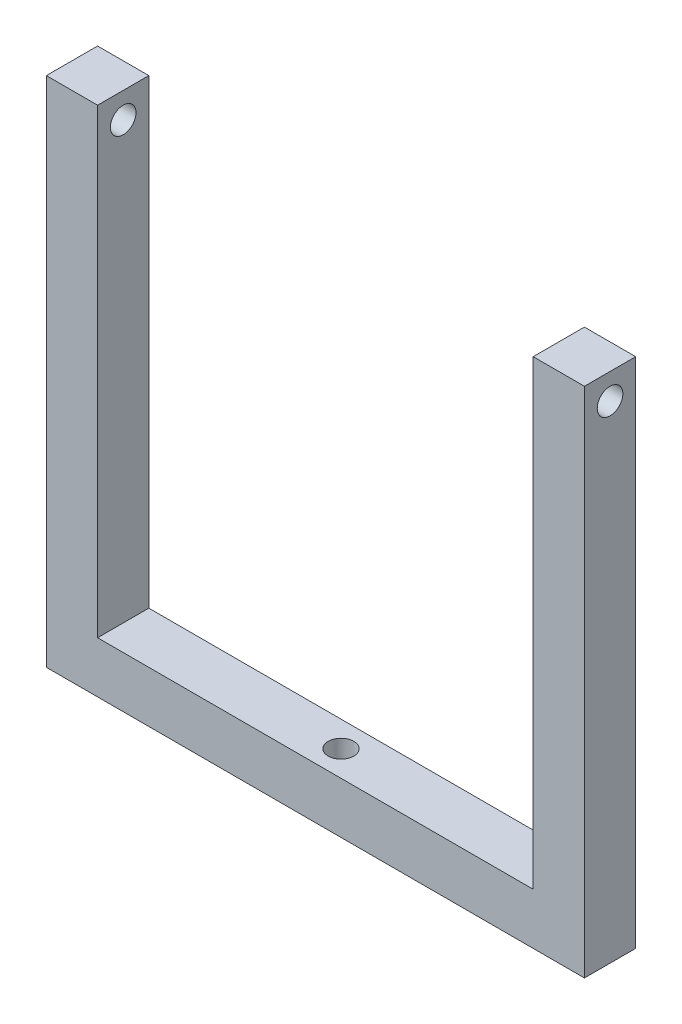
ISO-10303-21;
HEADER;
FILE_DESCRIPTION(('STEP AP214'),'2;1');
FILE_NAME('part.step','',(''),(''),'','','');
FILE_SCHEMA(('AUTOMOTIVE_DESIGN { 1 0 10303 214 1 1 1 1 }'));
ENDSEC;
DATA;
#1=APPLICATION_CONTEXT('core data for automotive mechanical design processes');
#2=APPLICATION_PROTOCOL_DEFINITION('international standard','automotive_design',2000,#1);
#3=PRODUCT_CONTEXT('',#1,'mechanical');
#4=PRODUCT('Part','Part','',(#3));
#5=PRODUCT_RELATED_PRODUCT_CATEGORY('part','',(#4));
#6=PRODUCT_DEFINITION_FORMATION('','',#4);
#7=PRODUCT_DEFINITION_CONTEXT('part definition',#1,'design');
#8=PRODUCT_DEFINITION('design','',#6,#7);
#9=PRODUCT_DEFINITION_SHAPE('','',#8);
#10=(LENGTH_UNIT() NAMED_UNIT(*) SI_UNIT(.MILLI.,.METRE.));
#11=(NAMED_UNIT(*) PLANE_ANGLE_UNIT() SI_UNIT($,.RADIAN.));
#12=(NAMED_UNIT(*) SI_UNIT($,.STERADIAN.) SOLID_ANGLE_UNIT());
#13=UNCERTAINTY_MEASURE_WITH_UNIT(LENGTH_MEASURE(1.E-05),#10,'distance_accuracy_value','');
#14=(GEOMETRIC_REPRESENTATION_CONTEXT(3) GLOBAL_UNCERTAINTY_ASSIGNED_CONTEXT((#13)) GLOBAL_UNIT_ASSIGNED_CONTEXT((#10,
#11,#12)) REPRESENTATION_CONTEXT('',''));
#15=CARTESIAN_POINT('',(0.,0.,0.));
#16=DIRECTION('',(0.,0.,1.));
#17=DIRECTION('',(1.,0.,0.));
#18=AXIS2_PLACEMENT_3D('',#15,#16,#17);
#19=CARTESIAN_POINT('',(0.,0.,12.7));
#20=DIRECTION('',(0.,-1.,0.));
#21=DIRECTION('',(1.,0.,0.));
#22=AXIS2_PLACEMENT_3D('',#19,#20,#21);
#23=PLANE('',#22);
#24=DIRECTION('',(-1.,0.,0.));
#25=VECTOR('',#24,1.);
#26=CARTESIAN_POINT('',(0.,0.,0.));
#27=LINE('',#26,#25);
#28=CARTESIAN_POINT('',(0.,0.,0.));
#29=VERTEX_POINT('',#28);
#30=CARTESIAN_POINT('',(-12.7,0.,0.));
#31=VERTEX_POINT('',#30);
#32=EDGE_CURVE('E141',#29,#31,#27,.T.);
#33=ORIENTED_EDGE('',*,*,#32,.T.);
#34=DIRECTION('',(0.,0.,-1.));
#35=VECTOR('',#34,1.);
#36=CARTESIAN_POINT('',(-12.7,0.,12.7));
#37=LINE('',#36,#35);
#38=CARTESIAN_POINT('',(-12.7,0.,12.7));
#39=VERTEX_POINT('',#38);
#40=EDGE_CURVE('E11',#39,#31,#37,.T.);
#41=ORIENTED_EDGE('',*,*,#40,.F.);
#42=DIRECTION('',(-1.,0.,0.));
#43=VECTOR('',#42,1.);
#44=CARTESIAN_POINT('',(0.,0.,12.7));
#45=LINE('',#44,#43);
#46=CARTESIAN_POINT('',(0.,0.,12.7));
#47=VERTEX_POINT('',#46);
#48=EDGE_CURVE('E164',#47,#39,#45,.T.);
#49=ORIENTED_EDGE('',*,*,#48,.F.);
#50=DIRECTION('',(0.,0.,-1.));
#51=VECTOR('',#50,1.);
#52=CARTESIAN_POINT('',(0.,0.,12.7));
#53=LINE('',#52,#51);
#54=EDGE_CURVE('E137',#47,#29,#53,.T.);
#55=ORIENTED_EDGE('',*,*,#54,.T.);
#56=EDGE_LOOP('',(#33,#41,#49,#55));
#57=FACE_BOUND('',#56,.T.);
#58=ADVANCED_FACE('F39',(#57),#23,.F.);
#59=CARTESIAN_POINT('',(-12.7,0.,12.7));
#60=DIRECTION('',(1.,0.,0.));
#61=DIRECTION('',(0.,1.,0.));
#62=AXIS2_PLACEMENT_3D('',#59,#60,#61);
#63=PLANE('',#62);
#64=CARTESIAN_POINT('',(-12.7,-6.35,6.35));
#65=DIRECTION('',(-1.,0.,0.));
#66=DIRECTION('',(0.,-1.,0.));
#67=AXIS2_PLACEMENT_3D('',#64,#65,#66);
#68=CIRCLE('',#67,3.175);
#69=CARTESIAN_POINT('',(-12.7,-9.525,6.35));
#70=VERTEX_POINT('',#69);
#71=EDGE_CURVE('E216',#70,#70,#68,.T.);
#72=ORIENTED_EDGE('',*,*,#71,.F.);
#73=EDGE_LOOP('',(#72));
#74=FACE_BOUND('',#73,.T.);
#75=DIRECTION('',(0.,-1.,0.));
#76=VECTOR('',#75,1.);
#77=CARTESIAN_POINT('',(-12.7,0.,0.));
#78=LINE('',#77,#76);
#79=CARTESIAN_POINT('',(-12.7,-127.,0.));
#80=VERTEX_POINT('',#79);
#81=EDGE_CURVE('E145',#31,#80,#78,.T.);
#82=ORIENTED_EDGE('',*,*,#81,.T.);
#83=DIRECTION('',(0.,0.,-1.));
#84=VECTOR('',#83,1.);
#85=CARTESIAN_POINT('',(-12.7,-127.,12.7));
#86=LINE('',#85,#84);
#87=CARTESIAN_POINT('',(-12.7,-127.,12.7));
#88=VERTEX_POINT('',#87);
#89=EDGE_CURVE('E49',#88,#80,#86,.T.);
#90=ORIENTED_EDGE('',*,*,#89,.F.);
#91=DIRECTION('',(0.,-1.,0.));
#92=VECTOR('',#91,1.);
#93=CARTESIAN_POINT('',(-12.7,0.,12.7));
#94=LINE('',#93,#92);
#95=EDGE_CURVE('E100',#39,#88,#94,.T.);
#96=ORIENTED_EDGE('',*,*,#95,.F.);
#97=ORIENTED_EDGE('',*,*,#40,.T.);
#98=EDGE_LOOP('',(#82,#90,#96,#97));
#99=FACE_BOUND('',#98,.T.);
#100=ADVANCED_FACE('F243',(#74,#99),#63,.F.);
#101=CARTESIAN_POINT('',(-12.7,-127.,12.7));
#102=DIRECTION('',(0.,1.,0.));
#103=DIRECTION('',(0.,0.,1.));
#104=AXIS2_PLACEMENT_3D('',#101,#102,#103);
#105=PLANE('',#104);
#106=CARTESIAN_POINT('',(53.975,-127.,6.35));
#107=DIRECTION('',(0.,1.,0.));
#108=DIRECTION('',(0.,0.,1.));
#109=AXIS2_PLACEMENT_3D('',#106,#107,#108);
#110=CIRCLE('',#109,3.17500000000001);
#111=CARTESIAN_POINT('',(53.975,-127.,9.52500000000001));
#112=VERTEX_POINT('',#111);
#113=EDGE_CURVE('E220',#112,#112,#110,.F.);
#114=ORIENTED_EDGE('',*,*,#113,.F.);
#115=EDGE_LOOP('',(#114));
#116=FACE_BOUND('',#115,.T.);
#117=DIRECTION('',(1.,0.,0.));
#118=VECTOR('',#117,1.);
#119=CARTESIAN_POINT('',(-12.7,-127.,0.));
#120=LINE('',#119,#118);
#121=CARTESIAN_POINT('',(120.65,-127.,0.));
#122=VERTEX_POINT('',#121);
#123=EDGE_CURVE('E149',#80,#122,#120,.T.);
#124=ORIENTED_EDGE('',*,*,#123,.T.);
#125=DIRECTION('',(0.,0.,-1.));
#126=VECTOR('',#125,1.);
#127=CARTESIAN_POINT('',(120.65,-127.,12.7));
#128=LINE('',#127,#126);
#129=CARTESIAN_POINT('',(120.65,-127.,12.7));
#130=VERTEX_POINT('',#129);
#131=EDGE_CURVE('E175',#130,#122,#128,.T.);
#132=ORIENTED_EDGE('',*,*,#131,.F.);
#133=DIRECTION('',(1.,0.,0.));
#134=VECTOR('',#133,1.);
#135=CARTESIAN_POINT('',(-12.7,-127.,12.7));
#136=LINE('',#135,#134);
#137=EDGE_CURVE('E186',#88,#130,#136,.T.);
#138=ORIENTED_EDGE('',*,*,#137,.F.);
#139=ORIENTED_EDGE('',*,*,#89,.T.);
#140=EDGE_LOOP('',(#124,#132,#138,#139));
#141=FACE_BOUND('',#140,.T.);
#142=ADVANCED_FACE('F184',(#116,#141),#105,.F.);
#143=CARTESIAN_POINT('',(120.65,-127.,12.7));
#144=DIRECTION('',(-1.,0.,0.));
#145=DIRECTION('',(0.,0.,1.));
#146=AXIS2_PLACEMENT_3D('',#143,#144,#145);
#147=PLANE('',#146);
#148=CARTESIAN_POINT('',(120.65,-6.34999999999998,6.35));
#149=DIRECTION('',(-1.,0.,0.));
#150=DIRECTION('',(0.,0.,1.));
#151=AXIS2_PLACEMENT_3D('',#148,#149,#150);
#152=CIRCLE('',#151,3.175);
#153=CARTESIAN_POINT('',(120.65,-6.34999999999998,9.525));
#154=VERTEX_POINT('',#153);
#155=EDGE_CURVE('E212',#154,#154,#152,.F.);
#156=ORIENTED_EDGE('',*,*,#155,.F.);
#157=EDGE_LOOP('',(#156));
#158=FACE_BOUND('',#157,.T.);
#159=DIRECTION('',(0.,1.,0.));
#160=VECTOR('',#159,1.);
#161=CARTESIAN_POINT('',(120.65,-127.,0.));
#162=LINE('',#161,#160);
#163=CARTESIAN_POINT('',(120.65,0.,0.));
#164=VERTEX_POINT('',#163);
#165=EDGE_CURVE('E152',#122,#164,#162,.T.);
#166=ORIENTED_EDGE('',*,*,#165,.T.);
#167=DIRECTION('',(0.,0.,-1.));
#168=VECTOR('',#167,1.);
#169=CARTESIAN_POINT('',(120.65,0.,12.7));
#170=LINE('',#169,#168);
#171=CARTESIAN_POINT('',(120.65,0.,12.7));
#172=VERTEX_POINT('',#171);
#173=EDGE_CURVE('E171',#172,#164,#170,.T.);
#174=ORIENTED_EDGE('',*,*,#173,.F.);
#175=DIRECTION('',(0.,1.,0.));
#176=VECTOR('',#175,1.);
#177=CARTESIAN_POINT('',(120.65,-127.,12.7));
#178=LINE('',#177,#176);
#179=EDGE_CURVE('E199',#130,#172,#178,.T.);
#180=ORIENTED_EDGE('',*,*,#179,.F.);
#181=ORIENTED_EDGE('',*,*,#131,.T.);
#182=EDGE_LOOP('',(#166,#174,#180,#181));
#183=FACE_BOUND('',#182,.T.);
#184=ADVANCED_FACE('F194',(#158,#183),#147,.F.);
#185=CARTESIAN_POINT('',(120.65,0.,12.7));
#186=DIRECTION('',(0.,-1.,0.));
#187=DIRECTION('',(1.,0.,0.));
#188=AXIS2_PLACEMENT_3D('',#185,#186,#187);
#189=PLANE('',#188);
#190=DIRECTION('',(-1.,0.,0.));
#191=VECTOR('',#190,1.);
#192=CARTESIAN_POINT('',(120.65,0.,0.));
#193=LINE('',#192,#191);
#194=CARTESIAN_POINT('',(107.95,0.,0.));
#195=VERTEX_POINT('',#194);
#196=EDGE_CURVE('E155',#164,#195,#193,.T.);
#197=ORIENTED_EDGE('',*,*,#196,.T.);
#198=DIRECTION('',(0.,0.,-1.));
#199=VECTOR('',#198,1.);
#200=CARTESIAN_POINT('',(107.95,0.,12.7));
#201=LINE('',#200,#199);
#202=CARTESIAN_POINT('',(107.95,0.,12.7));
#203=VERTEX_POINT('',#202);
#204=EDGE_CURVE('E130',#203,#195,#201,.T.);
#205=ORIENTED_EDGE('',*,*,#204,.F.);
#206=DIRECTION('',(-1.,0.,0.));
#207=VECTOR('',#206,1.);
#208=CARTESIAN_POINT('',(120.65,0.,12.7));
#209=LINE('',#208,#207);
#210=EDGE_CURVE('E119',#172,#203,#209,.T.);
#211=ORIENTED_EDGE('',*,*,#210,.F.);
#212=ORIENTED_EDGE('',*,*,#173,.T.);
#213=EDGE_LOOP('',(#197,#205,#211,#212));
#214=FACE_BOUND('',#213,.T.);
#215=ADVANCED_FACE('F197',(#214),#189,.F.);
#216=CARTESIAN_POINT('',(107.95,0.,12.7));
#217=DIRECTION('',(1.,0.,0.));
#218=DIRECTION('',(0.,1.,0.));
#219=AXIS2_PLACEMENT_3D('',#216,#217,#218);
#220=PLANE('',#219);
#221=CARTESIAN_POINT('',(107.95,-6.34999999999999,6.35));
#222=DIRECTION('',(1.,0.,0.));
#223=DIRECTION('',(0.,1.,0.));
#224=AXIS2_PLACEMENT_3D('',#221,#222,#223);
#225=CIRCLE('',#224,3.175);
#226=CARTESIAN_POINT('',(107.95,-3.17499999999998,6.35));
#227=VERTEX_POINT('',#226);
#228=EDGE_CURVE('E146',#227,#227,#225,.T.);
#229=ORIENTED_EDGE('',*,*,#228,.T.);
#230=EDGE_LOOP('',(#229));
#231=FACE_BOUND('',#230,.T.);
#232=DIRECTION('',(0.,-1.,0.));
#233=VECTOR('',#232,1.);
#234=CARTESIAN_POINT('',(107.95,0.,0.));
#235=LINE('',#234,#233);
#236=CARTESIAN_POINT('',(107.95,-114.3,0.));
#237=VERTEX_POINT('',#236);
#238=EDGE_CURVE('E128',#195,#237,#235,.T.);
#239=ORIENTED_EDGE('',*,*,#238,.T.);
#240=DIRECTION('',(0.,0.,-1.));
#241=VECTOR('',#240,1.);
#242=CARTESIAN_POINT('',(107.95,-114.3,12.7));
#243=LINE('',#242,#241);
#244=CARTESIAN_POINT('',(107.95,-114.3,12.7));
#245=VERTEX_POINT('',#244);
#246=EDGE_CURVE('E125',#245,#237,#243,.T.);
#247=ORIENTED_EDGE('',*,*,#246,.F.);
#248=DIRECTION('',(0.,-1.,0.));
#249=VECTOR('',#248,1.);
#250=CARTESIAN_POINT('',(107.95,0.,12.7));
#251=LINE('',#250,#249);
#252=EDGE_CURVE('E113',#203,#245,#251,.T.);
#253=ORIENTED_EDGE('',*,*,#252,.F.);
#254=ORIENTED_EDGE('',*,*,#204,.T.);
#255=EDGE_LOOP('',(#239,#247,#253,#254));
#256=FACE_BOUND('',#255,.T.);
#257=ADVANCED_FACE('F126',(#231,#256),#220,.F.);
#258=CARTESIAN_POINT('',(107.95,-114.3,12.7));
#259=DIRECTION('',(0.,-1.,0.));
#260=DIRECTION('',(1.,0.,0.));
#261=AXIS2_PLACEMENT_3D('',#258,#259,#260);
#262=PLANE('',#261);
#263=CARTESIAN_POINT('',(53.975,-114.3,6.35));
#264=DIRECTION('',(0.,1.,0.));
#265=DIRECTION('',(-1.,0.,0.));
#266=AXIS2_PLACEMENT_3D('',#263,#264,#265);
#267=CIRCLE('',#266,3.17500000000001);
#268=CARTESIAN_POINT('',(50.8,-114.3,6.35));
#269=VERTEX_POINT('',#268);
#270=EDGE_CURVE('E224',#269,#269,#267,.T.);
#271=ORIENTED_EDGE('',*,*,#270,.F.);
#272=EDGE_LOOP('',(#271));
#273=FACE_BOUND('',#272,.T.);
#274=DIRECTION('',(-1.,0.,0.));
#275=VECTOR('',#274,1.);
#276=CARTESIAN_POINT('',(107.95,-114.3,0.));
#277=LINE('',#276,#275);
#278=CARTESIAN_POINT('',(0.,-114.3,0.));
#279=VERTEX_POINT('',#278);
#280=EDGE_CURVE('E86',#237,#279,#277,.T.);
#281=ORIENTED_EDGE('',*,*,#280,.T.);
#282=DIRECTION('',(0.,0.,-1.));
#283=VECTOR('',#282,1.);
#284=CARTESIAN_POINT('',(0.,-114.3,12.7));
#285=LINE('',#284,#283);
#286=CARTESIAN_POINT('',(0.,-114.3,12.7));
#287=VERTEX_POINT('',#286);
#288=EDGE_CURVE('E131',#287,#279,#285,.T.);
#289=ORIENTED_EDGE('',*,*,#288,.F.);
#290=DIRECTION('',(-1.,0.,0.));
#291=VECTOR('',#290,1.);
#292=CARTESIAN_POINT('',(107.95,-114.3,12.7));
#293=LINE('',#292,#291);
#294=EDGE_CURVE('E117',#245,#287,#293,.T.);
#295=ORIENTED_EDGE('',*,*,#294,.F.);
#296=ORIENTED_EDGE('',*,*,#246,.T.);
#297=EDGE_LOOP('',(#281,#289,#295,#296));
#298=FACE_BOUND('',#297,.T.);
#299=ADVANCED_FACE('F133',(#273,#298),#262,.F.);
#300=CARTESIAN_POINT('',(0.,-114.3,12.7));
#301=DIRECTION('',(-1.,0.,0.));
#302=DIRECTION('',(0.,0.,1.));
#303=AXIS2_PLACEMENT_3D('',#300,#301,#302);
#304=PLANE('',#303);
#305=CARTESIAN_POINT('',(0.,-6.35,6.35));
#306=DIRECTION('',(-1.,0.,0.));
#307=DIRECTION('',(0.,0.,1.));
#308=AXIS2_PLACEMENT_3D('',#305,#306,#307);
#309=CIRCLE('',#308,3.175);
#310=CARTESIAN_POINT('',(0.,-6.35,9.525));
#311=VERTEX_POINT('',#310);
#312=EDGE_CURVE('E42',#311,#311,#309,.T.);
#313=ORIENTED_EDGE('',*,*,#312,.T.);
#314=EDGE_LOOP('',(#313));
#315=FACE_BOUND('',#314,.T.);
#316=DIRECTION('',(0.,1.,0.));
#317=VECTOR('',#316,1.);
#318=CARTESIAN_POINT('',(0.,-114.3,0.));
#319=LINE('',#318,#317);
#320=EDGE_CURVE('E92',#279,#29,#319,.T.);
#321=ORIENTED_EDGE('',*,*,#320,.T.);
#322=ORIENTED_EDGE('',*,*,#54,.F.);
#323=DIRECTION('',(0.,1.,0.));
#324=VECTOR('',#323,1.);
#325=CARTESIAN_POINT('',(0.,-114.3,12.7));
#326=LINE('',#325,#324);
#327=EDGE_CURVE('E57',#287,#47,#326,.T.);
#328=ORIENTED_EDGE('',*,*,#327,.F.);
#329=ORIENTED_EDGE('',*,*,#288,.T.);
#330=EDGE_LOOP('',(#321,#322,#328,#329));
#331=FACE_BOUND('',#330,.T.);
#332=ADVANCED_FACE('F232',(#315,#331),#304,.F.);
#333=CARTESIAN_POINT('',(0.,0.,12.7));
#334=DIRECTION('',(0.,0.,1.));
#335=DIRECTION('',(1.,0.,0.));
#336=AXIS2_PLACEMENT_3D('',#333,#334,#335);
#337=PLANE('',#336);
#338=ORIENTED_EDGE('',*,*,#48,.T.);
#339=ORIENTED_EDGE('',*,*,#95,.T.);
#340=ORIENTED_EDGE('',*,*,#137,.T.);
#341=ORIENTED_EDGE('',*,*,#179,.T.);
#342=ORIENTED_EDGE('',*,*,#210,.T.);
#343=ORIENTED_EDGE('',*,*,#252,.T.);
#344=ORIENTED_EDGE('',*,*,#294,.T.);
#345=ORIENTED_EDGE('',*,*,#327,.T.);
#346=EDGE_LOOP('',(#338,#339,#340,#341,#342,#343,#344,#345));
#347=FACE_BOUND('',#346,.T.);
#348=ADVANCED_FACE('F115',(#347),#337,.T.);
#349=CARTESIAN_POINT('',(0.,0.,0.));
#350=DIRECTION('',(0.,0.,1.));
#351=DIRECTION('',(1.,0.,0.));
#352=AXIS2_PLACEMENT_3D('',#349,#350,#351);
#353=PLANE('',#352);
#354=ORIENTED_EDGE('',*,*,#32,.F.);
#355=ORIENTED_EDGE('',*,*,#320,.F.);
#356=ORIENTED_EDGE('',*,*,#280,.F.);
#357=ORIENTED_EDGE('',*,*,#238,.F.);
#358=ORIENTED_EDGE('',*,*,#196,.F.);
#359=ORIENTED_EDGE('',*,*,#165,.F.);
#360=ORIENTED_EDGE('',*,*,#123,.F.);
#361=ORIENTED_EDGE('',*,*,#81,.F.);
#362=EDGE_LOOP('',(#354,#355,#356,#357,#358,#359,#360,#361));
#363=FACE_BOUND('',#362,.T.);
#364=ADVANCED_FACE('F190',(#363),#353,.F.);
#365=CARTESIAN_POINT('',(129.630256121069,-6.34999999999998,6.35));
#366=DIRECTION('',(-1.,0.,0.));
#367=DIRECTION('',(0.,-1.,0.));
#368=AXIS2_PLACEMENT_3D('',#365,#366,#367);
#369=CYLINDRICAL_SURFACE('',#368,3.175);
#370=ORIENTED_EDGE('',*,*,#71,.T.);
#371=EDGE_LOOP('',(#370));
#372=FACE_BOUND('',#371,.T.);
#373=ORIENTED_EDGE('',*,*,#312,.F.);
#374=EDGE_LOOP('',(#373));
#375=FACE_BOUND('',#374,.T.);
#376=ADVANCED_FACE('F287',(#372,#375),#369,.F.);
#377=ORIENTED_EDGE('',*,*,#155,.T.);
#378=EDGE_LOOP('',(#377));
#379=FACE_BOUND('',#378,.T.);
#380=ORIENTED_EDGE('',*,*,#228,.F.);
#381=EDGE_LOOP('',(#380));
#382=FACE_BOUND('',#381,.T.);
#383=ADVANCED_FACE('F292',(#379,#382),#369,.F.);
#384=CARTESIAN_POINT('',(53.975,-135.980256121069,6.35));
#385=DIRECTION('',(0.,1.,0.));
#386=DIRECTION('',(-1.,0.,0.));
#387=AXIS2_PLACEMENT_3D('',#384,#385,#386);
#388=CYLINDRICAL_SURFACE('',#387,3.17500000000001);
#389=ORIENTED_EDGE('',*,*,#113,.T.);
#390=EDGE_LOOP('',(#389));
#391=FACE_BOUND('',#390,.T.);
#392=ORIENTED_EDGE('',*,*,#270,.T.);
#393=EDGE_LOOP('',(#392));
#394=FACE_BOUND('',#393,.T.);
#395=ADVANCED_FACE('F229',(#391,#394),#388,.F.);
#396=CLOSED_SHELL('',(#58,#100,#142,#184,#215,#257,#299,#332,#348,#364,#376,#383,#395));
#397=MANIFOLD_SOLID_BREP('B2',#396);
#398=ADVANCED_BREP_SHAPE_REPRESENTATION('',(#18,#397),#14);
#399=SHAPE_DEFINITION_REPRESENTATION(#9,#398);
ENDSEC;
END-ISO-10303-21;
